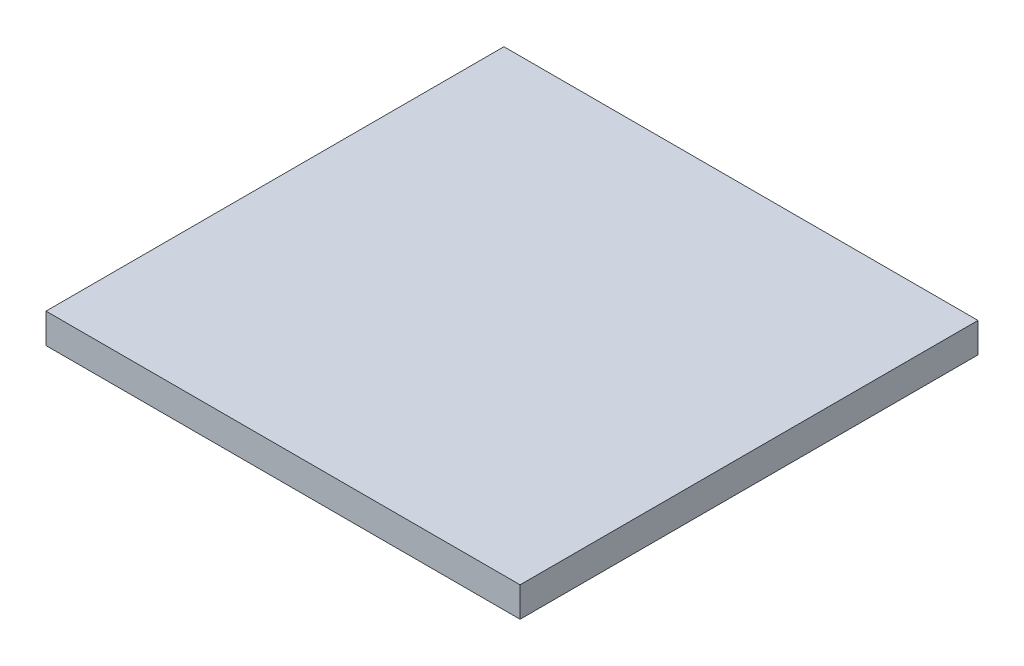
ISO-10303-21;
HEADER;
FILE_DESCRIPTION(('STEP AP214'),'2;1');
FILE_NAME('part.step','',(''),(''),'','','');
FILE_SCHEMA(('AUTOMOTIVE_DESIGN { 1 0 10303 214 1 1 1 1 }'));
ENDSEC;
DATA;
#1=APPLICATION_CONTEXT('core data for automotive mechanical design processes');
#2=APPLICATION_PROTOCOL_DEFINITION('international standard','automotive_design',2000,#1);
#3=PRODUCT_CONTEXT('',#1,'mechanical');
#4=PRODUCT('Part','Part','',(#3));
#5=PRODUCT_RELATED_PRODUCT_CATEGORY('part','',(#4));
#6=PRODUCT_DEFINITION_FORMATION('','',#4);
#7=PRODUCT_DEFINITION_CONTEXT('part definition',#1,'design');
#8=PRODUCT_DEFINITION('design','',#6,#7);
#9=PRODUCT_DEFINITION_SHAPE('','',#8);
#10=(LENGTH_UNIT() NAMED_UNIT(*) SI_UNIT(.MILLI.,.METRE.));
#11=(NAMED_UNIT(*) PLANE_ANGLE_UNIT() SI_UNIT($,.RADIAN.));
#12=(NAMED_UNIT(*) SI_UNIT($,.STERADIAN.) SOLID_ANGLE_UNIT());
#13=UNCERTAINTY_MEASURE_WITH_UNIT(LENGTH_MEASURE(1.E-05),#10,'distance_accuracy_value','');
#14=(GEOMETRIC_REPRESENTATION_CONTEXT(3) GLOBAL_UNCERTAINTY_ASSIGNED_CONTEXT((#13)) GLOBAL_UNIT_ASSIGNED_CONTEXT((#10,
#11,#12)) REPRESENTATION_CONTEXT('',''));
#15=CARTESIAN_POINT('',(0.,0.,0.));
#16=DIRECTION('',(0.,0.,1.));
#17=DIRECTION('',(1.,0.,0.));
#18=AXIS2_PLACEMENT_3D('',#15,#16,#17);
#19=CARTESIAN_POINT('',(119.055,15.,-115.));
#20=DIRECTION('',(-1.,0.,0.));
#21=DIRECTION('',(0.,0.,1.));
#22=AXIS2_PLACEMENT_3D('',#19,#20,#21);
#23=PLANE('',#22);
#24=DIRECTION('',(0.,0.,-1.));
#25=VECTOR('',#24,1.);
#26=CARTESIAN_POINT('',(119.055,0.,-115.));
#27=LINE('',#26,#25);
#28=CARTESIAN_POINT('',(119.055,0.,115.));
#29=VERTEX_POINT('',#28);
#30=CARTESIAN_POINT('',(119.055,0.,-115.));
#31=VERTEX_POINT('',#30);
#32=EDGE_CURVE('E98',#29,#31,#27,.T.);
#33=ORIENTED_EDGE('',*,*,#32,.T.);
#34=DIRECTION('',(0.,-1.,0.));
#35=VECTOR('',#34,1.);
#36=CARTESIAN_POINT('',(119.055,15.,-115.));
#37=LINE('',#36,#35);
#38=CARTESIAN_POINT('',(119.055,15.,-115.));
#39=VERTEX_POINT('',#38);
#40=EDGE_CURVE('E11',#39,#31,#37,.T.);
#41=ORIENTED_EDGE('',*,*,#40,.F.);
#42=DIRECTION('',(0.,0.,-1.));
#43=VECTOR('',#42,1.);
#44=CARTESIAN_POINT('',(119.055,15.,-115.));
#45=LINE('',#44,#43);
#46=CARTESIAN_POINT('',(119.055,15.,115.));
#47=VERTEX_POINT('',#46);
#48=EDGE_CURVE('E86',#47,#39,#45,.T.);
#49=ORIENTED_EDGE('',*,*,#48,.F.);
#50=DIRECTION('',(0.,-1.,0.));
#51=VECTOR('',#50,1.);
#52=CARTESIAN_POINT('',(119.055,15.,115.));
#53=LINE('',#52,#51);
#54=EDGE_CURVE('E94',#47,#29,#53,.T.);
#55=ORIENTED_EDGE('',*,*,#54,.T.);
#56=EDGE_LOOP('',(#33,#41,#49,#55));
#57=FACE_BOUND('',#56,.T.);
#58=ADVANCED_FACE('F35',(#57),#23,.F.);
#59=CARTESIAN_POINT('',(-119.055,15.,-115.));
#60=DIRECTION('',(0.,0.,1.));
#61=DIRECTION('',(1.,0.,0.));
#62=AXIS2_PLACEMENT_3D('',#59,#60,#61);
#63=PLANE('',#62);
#64=DIRECTION('',(-1.,0.,0.));
#65=VECTOR('',#64,1.);
#66=CARTESIAN_POINT('',(-119.055,0.,-115.));
#67=LINE('',#66,#65);
#68=CARTESIAN_POINT('',(-119.055,0.,-115.));
#69=VERTEX_POINT('',#68);
#70=EDGE_CURVE('E90',#31,#69,#67,.T.);
#71=ORIENTED_EDGE('',*,*,#70,.T.);
#72=DIRECTION('',(0.,-1.,0.));
#73=VECTOR('',#72,1.);
#74=CARTESIAN_POINT('',(-119.055,15.,-115.));
#75=LINE('',#74,#73);
#76=CARTESIAN_POINT('',(-119.055,15.,-115.));
#77=VERTEX_POINT('',#76);
#78=EDGE_CURVE('E43',#77,#69,#75,.T.);
#79=ORIENTED_EDGE('',*,*,#78,.F.);
#80=DIRECTION('',(-1.,0.,0.));
#81=VECTOR('',#80,1.);
#82=CARTESIAN_POINT('',(-119.055,15.,-115.));
#83=LINE('',#82,#81);
#84=EDGE_CURVE('E81',#39,#77,#83,.T.);
#85=ORIENTED_EDGE('',*,*,#84,.F.);
#86=ORIENTED_EDGE('',*,*,#40,.T.);
#87=EDGE_LOOP('',(#71,#79,#85,#86));
#88=FACE_BOUND('',#87,.T.);
#89=ADVANCED_FACE('F89',(#88),#63,.F.);
#90=CARTESIAN_POINT('',(-119.055,15.,-115.));
#91=DIRECTION('',(1.,0.,0.));
#92=DIRECTION('',(0.,0.,-1.));
#93=AXIS2_PLACEMENT_3D('',#90,#91,#92);
#94=PLANE('',#93);
#95=DIRECTION('',(0.,0.,1.));
#96=VECTOR('',#95,1.);
#97=CARTESIAN_POINT('',(-119.055,0.,-115.));
#98=LINE('',#97,#96);
#99=CARTESIAN_POINT('',(-119.055,0.,115.));
#100=VERTEX_POINT('',#99);
#101=EDGE_CURVE('E68',#69,#100,#98,.T.);
#102=ORIENTED_EDGE('',*,*,#101,.T.);
#103=DIRECTION('',(0.,-1.,0.));
#104=VECTOR('',#103,1.);
#105=CARTESIAN_POINT('',(-119.055,15.,115.));
#106=LINE('',#105,#104);
#107=CARTESIAN_POINT('',(-119.055,15.,115.));
#108=VERTEX_POINT('',#107);
#109=EDGE_CURVE('E91',#108,#100,#106,.T.);
#110=ORIENTED_EDGE('',*,*,#109,.F.);
#111=DIRECTION('',(0.,0.,1.));
#112=VECTOR('',#111,1.);
#113=CARTESIAN_POINT('',(-119.055,15.,-115.));
#114=LINE('',#113,#112);
#115=EDGE_CURVE('E84',#77,#108,#114,.T.);
#116=ORIENTED_EDGE('',*,*,#115,.F.);
#117=ORIENTED_EDGE('',*,*,#78,.T.);
#118=EDGE_LOOP('',(#102,#110,#116,#117));
#119=FACE_BOUND('',#118,.T.);
#120=ADVANCED_FACE('F92',(#119),#94,.F.);
#121=CARTESIAN_POINT('',(-119.055,15.,115.));
#122=DIRECTION('',(0.,0.,-1.));
#123=DIRECTION('',(-1.,0.,0.));
#124=AXIS2_PLACEMENT_3D('',#121,#122,#123);
#125=PLANE('',#124);
#126=DIRECTION('',(1.,0.,0.));
#127=VECTOR('',#126,1.);
#128=CARTESIAN_POINT('',(-119.055,0.,115.));
#129=LINE('',#128,#127);
#130=EDGE_CURVE('E74',#100,#29,#129,.T.);
#131=ORIENTED_EDGE('',*,*,#130,.T.);
#132=ORIENTED_EDGE('',*,*,#54,.F.);
#133=DIRECTION('',(1.,0.,0.));
#134=VECTOR('',#133,1.);
#135=CARTESIAN_POINT('',(-119.055,15.,115.));
#136=LINE('',#135,#134);
#137=EDGE_CURVE('E51',#108,#47,#136,.T.);
#138=ORIENTED_EDGE('',*,*,#137,.F.);
#139=ORIENTED_EDGE('',*,*,#109,.T.);
#140=EDGE_LOOP('',(#131,#132,#138,#139));
#141=FACE_BOUND('',#140,.T.);
#142=ADVANCED_FACE('F105',(#141),#125,.F.);
#143=CARTESIAN_POINT('',(0.,15.,0.));
#144=DIRECTION('',(0.,1.,0.));
#145=DIRECTION('',(0.,0.,1.));
#146=AXIS2_PLACEMENT_3D('',#143,#144,#145);
#147=PLANE('',#146);
#148=ORIENTED_EDGE('',*,*,#48,.T.);
#149=ORIENTED_EDGE('',*,*,#84,.T.);
#150=ORIENTED_EDGE('',*,*,#115,.T.);
#151=ORIENTED_EDGE('',*,*,#137,.T.);
#152=EDGE_LOOP('',(#148,#149,#150,#151));
#153=FACE_BOUND('',#152,.T.);
#154=ADVANCED_FACE('F82',(#153),#147,.T.);
#155=CARTESIAN_POINT('',(0.,0.,0.));
#156=DIRECTION('',(0.,1.,0.));
#157=DIRECTION('',(0.,0.,1.));
#158=AXIS2_PLACEMENT_3D('',#155,#156,#157);
#159=PLANE('',#158);
#160=ORIENTED_EDGE('',*,*,#32,.F.);
#161=ORIENTED_EDGE('',*,*,#130,.F.);
#162=ORIENTED_EDGE('',*,*,#101,.F.);
#163=ORIENTED_EDGE('',*,*,#70,.F.);
#164=EDGE_LOOP('',(#160,#161,#162,#163));
#165=FACE_BOUND('',#164,.T.);
#166=ADVANCED_FACE('F108',(#165),#159,.F.);
#167=CLOSED_SHELL('',(#58,#89,#120,#142,#154,#166));
#168=MANIFOLD_SOLID_BREP('B2',#167);
#169=ADVANCED_BREP_SHAPE_REPRESENTATION('',(#18,#168),#14);
#170=SHAPE_DEFINITION_REPRESENTATION(#9,#169);
ENDSEC;
END-ISO-10303-21;
